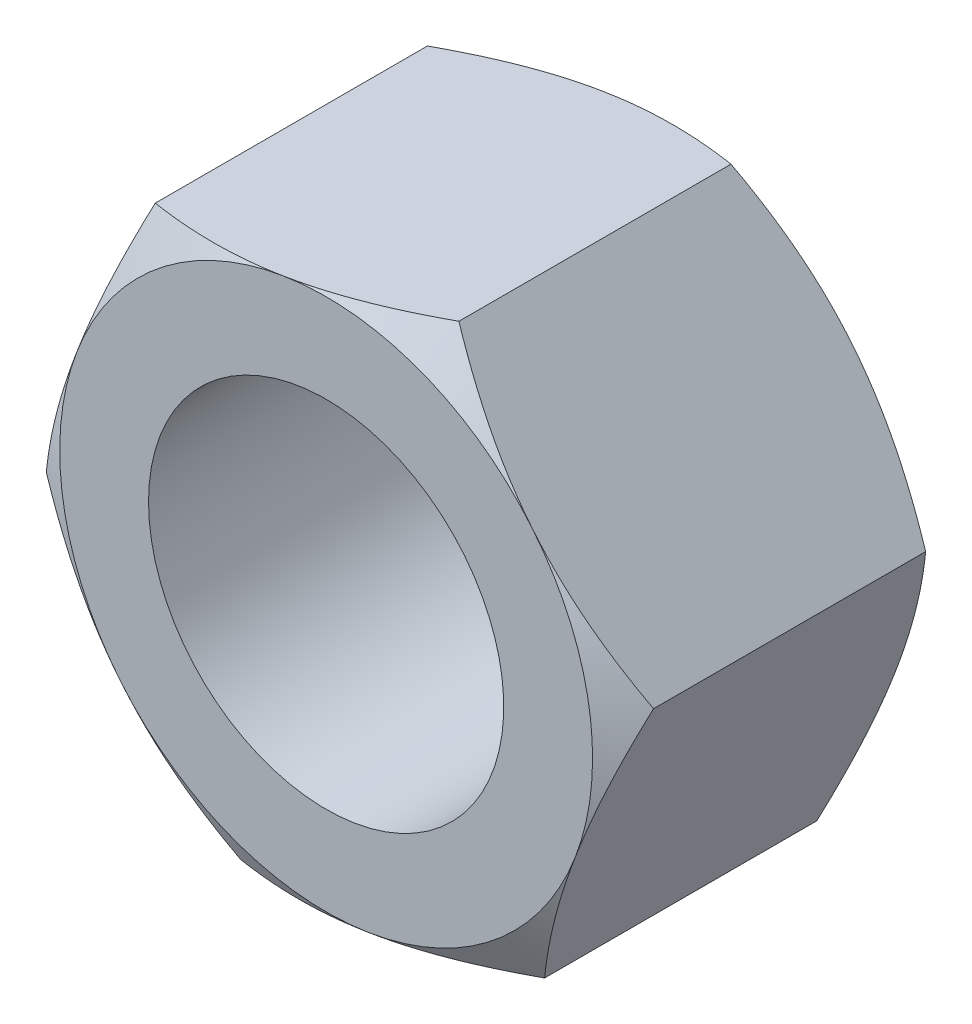
ISO-10303-21;
HEADER;
FILE_DESCRIPTION(('STEP AP214'),'2;1');
FILE_NAME('part.step','',(''),(''),'','','');
FILE_SCHEMA(('AUTOMOTIVE_DESIGN { 1 0 10303 214 1 1 1 1 }'));
ENDSEC;
DATA;
#1=APPLICATION_CONTEXT('core data for automotive mechanical design processes');
#2=APPLICATION_PROTOCOL_DEFINITION('international standard','automotive_design',2000,#1);
#3=PRODUCT_CONTEXT('',#1,'mechanical');
#4=PRODUCT('Part','Part','',(#3));
#5=PRODUCT_RELATED_PRODUCT_CATEGORY('part','',(#4));
#6=PRODUCT_DEFINITION_FORMATION('','',#4);
#7=PRODUCT_DEFINITION_CONTEXT('part definition',#1,'design');
#8=PRODUCT_DEFINITION('design','',#6,#7);
#9=PRODUCT_DEFINITION_SHAPE('','',#8);
#10=(LENGTH_UNIT() NAMED_UNIT(*) SI_UNIT(.MILLI.,.METRE.));
#11=(NAMED_UNIT(*) PLANE_ANGLE_UNIT() SI_UNIT($,.RADIAN.));
#12=(NAMED_UNIT(*) SI_UNIT($,.STERADIAN.) SOLID_ANGLE_UNIT());
#13=UNCERTAINTY_MEASURE_WITH_UNIT(LENGTH_MEASURE(1.E-05),#10,'distance_accuracy_value','');
#14=(GEOMETRIC_REPRESENTATION_CONTEXT(3) GLOBAL_UNCERTAINTY_ASSIGNED_CONTEXT((#13)) GLOBAL_UNIT_ASSIGNED_CONTEXT((#10,
#11,#12)) REPRESENTATION_CONTEXT('',''));
#15=CARTESIAN_POINT('',(0.,0.,0.));
#16=DIRECTION('',(0.,0.,1.));
#17=DIRECTION('',(1.,0.,0.));
#18=AXIS2_PLACEMENT_3D('',#15,#16,#17);
#19=CARTESIAN_POINT('',(17.0948695887191,2.78665278509688,18.));
#20=DIRECTION('',(-0.774299742655268,-0.632819017195269,0.));
#21=DIRECTION('',(0.632819017195269,-0.774299742655268,0.));
#22=AXIS2_PLACEMENT_3D('',#19,#20,#21);
#23=PLANE('',#22);
#24=CARTESIAN_POINT('',(6.13395923511371,16.1981177307612,1.33982052717155));
#25=CARTESIAN_POINT('',(6.37487228960455,15.9033432201573,1.22992936079631));
#26=CARTESIAN_POINT('',(6.61672503455555,15.6074189304512,1.12502482563688));
#27=CARTESIAN_POINT('',(7.10236990078995,15.0131973841175,0.926575134270641));
#28=CARTESIAN_POINT('',(7.34616263199957,14.7148993812012,0.833033714136867));
#29=CARTESIAN_POINT('',(7.8361586338396,14.1153539064011,0.65856763715766));
#30=CARTESIAN_POINT('',(8.08236619230935,13.8141011880365,0.577672832074371));
#31=CARTESIAN_POINT('',(8.57649215903798,13.2095024031058,0.430237032854698));
#32=CARTESIAN_POINT('',(8.82441046886155,12.9061564569825,0.36369521984922));
#33=CARTESIAN_POINT('',(9.31560531086254,12.3051441147166,0.24779566015694));
#34=CARTESIAN_POINT('',(9.55884537602245,12.0075223386019,0.198054307727139));
#35=CARTESIAN_POINT('',(10.046440087133,11.4109150163279,0.11464895428272));
#36=CARTESIAN_POINT('',(10.2907947544456,11.1119294440306,0.0809852627239923));
#37=CARTESIAN_POINT('',(10.779914577764,10.5134560368919,0.0305852201294935));
#38=CARTESIAN_POINT('',(11.0246788981289,10.2139692245173,0.0138287540684656));
#39=CARTESIAN_POINT('',(11.5144334885654,9.614719133994,-0.00239647678352351));
#40=CARTESIAN_POINT('',(11.7594237514215,9.31495586467371,-0.00186577573757736));
#41=CARTESIAN_POINT('',(12.2174323520223,8.75454928405148,0.0152758808352326));
#42=CARTESIAN_POINT('',(12.4304833272438,8.49386603844101,0.0297959665215578));
#43=CARTESIAN_POINT('',(12.8560952122298,7.97309917767838,0.0716361258822598));
#44=CARTESIAN_POINT('',(13.0686560862611,7.71301560624827,0.0989571049486546));
#45=CARTESIAN_POINT('',(13.4931723125134,7.19358936302795,0.165922688252999));
#46=CARTESIAN_POINT('',(13.7051270181676,6.93424748235882,0.205577470877832));
#47=CARTESIAN_POINT('',(14.1280427423889,6.4167795688932,0.296514920580842));
#48=CARTESIAN_POINT('',(14.3390036924066,6.15865361997175,0.34779837815498));
#49=CARTESIAN_POINT('',(14.9793874206901,5.37509790730025,0.520388145329581));
#50=CARTESIAN_POINT('',(15.4069557441958,4.85193720279842,0.658903515519795));
#51=CARTESIAN_POINT('',(16.2557167936781,3.81341679754461,0.973276820642969));
#52=CARTESIAN_POINT('',(16.6769203867982,3.29804380005818,1.14906092301589));
#53=CARTESIAN_POINT('',(17.0950330445443,2.78645278509688,1.33982052717155));
#54=B_SPLINE_CURVE_WITH_KNOTS('',3,(#24,#25,#26,#27,#28,#29,#30,#31,#32,#33,#34,#35,#36,#37,#38,
#39,#40,#41,#42,#43,#44,#45,#46,#47,#48,#49,#50,#51,#52,#53),.UNSPECIFIED.,.F.,.F.,(4,2,2,2,2,2,
2,2,2,2,2,2,2,2,4),(0.,1.18875505102513,2.37789990039879,3.56981061740352,4.76165331533933,
5.9240784402802,7.08652593817755,8.24758880143962,9.4086157885898,10.4193200709789,
11.4300958500779,12.4417079881192,13.4533889143223,15.5212404375788,17.5850330218421),.UNSPECIFIED.);
#55=CARTESIAN_POINT('',(6.13412269093897,16.1979177307612,1.33974596215561));
#56=VERTEX_POINT('',#55);
#57=CARTESIAN_POINT('',(11.614496139829,9.49228525792903,0.));
#58=VERTEX_POINT('',#57);
#59=EDGE_CURVE('E131',#56,#58,#54,.T.);
#60=ORIENTED_EDGE('',*,*,#59,.F.);
#61=DIRECTION('',(0.,0.,-1.));
#62=VECTOR('',#61,1.);
#63=CARTESIAN_POINT('',(6.13412269093897,16.1979177307612,18.));
#64=LINE('',#63,#62);
#65=CARTESIAN_POINT('',(6.13412269093897,16.1979177307612,16.6602540378444));
#66=VERTEX_POINT('',#65);
#67=EDGE_CURVE('E365',#66,#56,#64,.T.);
#68=ORIENTED_EDGE('',*,*,#67,.F.);
#69=CARTESIAN_POINT('',(17.0950330445443,2.78645278509688,16.6601794728284));
#70=CARTESIAN_POINT('',(16.8541199900535,3.08122729570075,16.7700706392037));
#71=CARTESIAN_POINT('',(16.6122672451025,3.37715158540686,16.8749751743631));
#72=CARTESIAN_POINT('',(16.1266223788681,3.97137313174056,17.0734248657294));
#73=CARTESIAN_POINT('',(15.8828296476585,4.26967113465691,17.1669662858631));
#74=CARTESIAN_POINT('',(15.3928336458184,4.86921660945697,17.3414323628423));
#75=CARTESIAN_POINT('',(15.1466260873487,5.1704693278216,17.4223271679256));
#76=CARTESIAN_POINT('',(14.6525001206201,5.77506811275224,17.5697629671453));
#77=CARTESIAN_POINT('',(14.4045818107965,6.07841405887555,17.6363047801508));
#78=CARTESIAN_POINT('',(13.9133869687955,6.67942640114149,17.7522043398431));
#79=CARTESIAN_POINT('',(13.6701469036356,6.97704817725612,17.8019456922729));
#80=CARTESIAN_POINT('',(13.182552192525,7.57365549953015,17.8853510457173));
#81=CARTESIAN_POINT('',(12.9381975252124,7.8726410718275,17.919014737276));
#82=CARTESIAN_POINT('',(12.449077701894,8.47111447896621,17.9694147798705));
#83=CARTESIAN_POINT('',(12.2043133815291,8.77060129134071,17.9861712459315));
#84=CARTESIAN_POINT('',(11.7145587910927,9.36985138186407,18.0023964767835));
#85=CARTESIAN_POINT('',(11.4695685282366,9.66961465118436,18.0018657757376));
#86=CARTESIAN_POINT('',(11.0115599276357,10.2300212318066,17.9847241191648));
#87=CARTESIAN_POINT('',(10.7985089524142,10.4907044774171,17.9702040334784));
#88=CARTESIAN_POINT('',(10.3728970674282,11.0114713381797,17.9283638741177));
#89=CARTESIAN_POINT('',(10.1603361933969,11.2715549096098,17.9010428950513));
#90=CARTESIAN_POINT('',(9.73581996714463,11.7909811528301,17.834077311747));
#91=CARTESIAN_POINT('',(9.52386526149044,12.0503230334992,17.7944225291222));
#92=CARTESIAN_POINT('',(9.10094953726917,12.5677909469649,17.7034850794192));
#93=CARTESIAN_POINT('',(8.8899885872514,12.8259168958863,17.652201621845));
#94=CARTESIAN_POINT('',(8.24960485896793,13.6094726085578,17.4796118546704));
#95=CARTESIAN_POINT('',(7.82203653546219,14.1326333130596,17.3410964844802));
#96=CARTESIAN_POINT('',(6.97327548597991,15.1711537183135,17.026723179357));
#97=CARTESIAN_POINT('',(6.55207189285984,15.6865267157999,16.8509390769841));
#98=CARTESIAN_POINT('',(6.13395923511371,16.1981177307612,16.6601794728284));
#99=B_SPLINE_CURVE_WITH_KNOTS('',3,(#69,#70,#71,#72,#73,#74,#75,#76,#77,#78,#79,#80,#81,#82,#83,
#84,#85,#86,#87,#88,#89,#90,#91,#92,#93,#94,#95,#96,#97,#98),.UNSPECIFIED.,.F.,.F.,(4,2,2,2,2,2,
2,2,2,2,2,2,2,2,4),(0.,1.18875505102512,2.37789990039879,3.56981061740352,4.76165331533933,
5.92407844028021,7.08652593817755,8.24758880143962,9.4086157885898,10.4193200709789,
11.4300958500779,12.4417079881192,13.4533889143223,15.5212404375788,17.5850330218421),.UNSPECIFIED.);
#100=CARTESIAN_POINT('',(11.614496139829,9.49228525792903,18.));
#101=VERTEX_POINT('',#100);
#102=EDGE_CURVE('E325',#101,#66,#99,.T.);
#103=ORIENTED_EDGE('',*,*,#102,.F.);
#104=CARTESIAN_POINT('',(17.0948695887191,2.78665278509688,16.6602540378444));
#105=VERTEX_POINT('',#104);
#106=EDGE_CURVE('E387',#105,#101,#99,.T.);
#107=ORIENTED_EDGE('',*,*,#106,.F.);
#108=DIRECTION('',(0.,0.,-1.));
#109=VECTOR('',#108,1.);
#110=CARTESIAN_POINT('',(17.0948695887191,2.78665278509688,18.));
#111=LINE('',#110,#109);
#112=CARTESIAN_POINT('',(17.0948695887191,2.78665278509688,1.33974596215561));
#113=VERTEX_POINT('',#112);
#114=EDGE_CURVE('E163',#105,#113,#111,.T.);
#115=ORIENTED_EDGE('',*,*,#114,.T.);
#116=EDGE_CURVE('E144',#58,#113,#54,.T.);
#117=ORIENTED_EDGE('',*,*,#116,.F.);
#118=EDGE_LOOP('',(#60,#68,#103,#107,#115,#117));
#119=FACE_BOUND('',#118,.T.);
#120=ADVANCED_FACE('F41',(#119),#23,.F.);
#121=CARTESIAN_POINT('',(6.13412269093897,16.1979177307612,18.));
#122=DIRECTION('',(0.160887473561371,-0.98697275588085,0.));
#123=DIRECTION('',(0.98697275588085,0.160887473561371,0.));
#124=AXIS2_PLACEMENT_3D('',#121,#122,#123);
#125=PLANE('',#124);
#126=CARTESIAN_POINT('',(-10.9609468977801,13.4112323434526,1.33980445975159));
#127=CARTESIAN_POINT('',(-10.5852086186242,13.4724818380243,1.22991395788935));
#128=CARTESIAN_POINT('',(-10.2080047584427,13.5339702385101,1.12501010375016));
#129=CARTESIAN_POINT('',(-9.45057230983405,13.6574401036345,0.926561803908741));
#130=CARTESIAN_POINT('',(-9.07034277014237,13.7194217233397,0.833021094286722));
#131=CARTESIAN_POINT('',(-8.30612413682555,13.8439978116159,0.658556468968256));
#132=CARTESIAN_POINT('',(-7.92212835584389,13.9065933703,0.577662404578657));
#133=CARTESIAN_POINT('',(-7.15146849684379,14.0322194495924,0.430228102794636));
#134=CARTESIAN_POINT('',(-6.76480457234779,14.0952499451748,0.363687046532846));
#135=CARTESIAN_POINT('',(-5.99871619964825,14.2201308216468,0.247788976072664));
#136=CARTESIAN_POINT('',(-5.61934862603502,14.2819719313492,0.19804835842544));
#137=CARTESIAN_POINT('',(-4.85887515754317,14.4059375163434,0.114644467773468));
#138=CARTESIAN_POINT('',(-4.47776922934708,14.4680619970663,0.0809815042327595));
#139=CARTESIAN_POINT('',(-3.71491718118555,14.59241531685,0.0305828918816009));
#140=CARTESIAN_POINT('',(-3.33317236446851,14.6546439434668,0.0138271283382526));
#141=CARTESIAN_POINT('',(-2.56933036070248,14.7791586369614,-0.00239674000065774));
#142=CARTESIAN_POINT('',(-2.18723318490649,14.8414447020047,-0.00186537898052446));
#143=CARTESIAN_POINT('',(-1.47290719130852,14.9578877382733,0.0152773703992494));
#144=CARTESIAN_POINT('',(-1.14062746383091,15.0120530083388,0.0297977558883504));
#145=CARTESIAN_POINT('',(-0.476832332517937,15.1202589552638,0.0716381899207127));
#146=CARTESIAN_POINT('',(-0.145316984411105,15.174299623039,0.0989591438000383));
#147=CARTESIAN_POINT('',(0.516769321829812,15.2822270125804,0.165924364125291));
#148=CARTESIAN_POINT('',(0.847339271606772,15.3361135699732,0.205578808312193));
#149=CARTESIAN_POINT('',(1.50692940830414,15.4436340562753,0.296515291740523));
#150=CARTESIAN_POINT('',(1.83594948831734,15.4972679677575,0.347798121437039));
#151=CARTESIAN_POINT('',(2.83470808273258,15.6600766633327,0.520385540050595));
#152=CARTESIAN_POINT('',(3.50155438310731,15.7687799845559,0.658898760480179));
#153=CARTESIAN_POINT('',(4.82530359998081,15.9845657454724,0.973266949162216));
#154=CARTESIAN_POINT('',(5.48222346436623,16.0916509478587,1.14904808891177));
#155=CARTESIAN_POINT('',(6.13432269093897,16.1979503329729,1.33980445975159));
#156=B_SPLINE_CURVE_WITH_KNOTS('',3,(#126,#127,#128,#129,#130,#131,#132,#133,#134,#135,#136,
#137,#138,#139,#140,#141,#142,#143,#144,#145,#146,#147,#148,#149,#150,#151,#152,#153,#154,#155),
.UNSPECIFIED.,.F.,.F.,(4,2,2,2,2,2,2,2,2,2,2,2,2,2,4),(0.,1.18875314681579,2.37789609110278,
3.56980485096621,4.76164559209222,5.92406899343983,7.08651476830915,8.24757592871961,
9.40860121155788,10.419293173283,11.430056628243,12.4416564000673,13.4533249573674,
15.5211504488646,17.584917185935),.UNSPECIFIED.);
#157=CARTESIAN_POINT('',(-10.9607468977801,13.4112649456643,1.33974596215561));
#158=VERTEX_POINT('',#157);
#159=CARTESIAN_POINT('',(-2.41331210342056,14.8045913382127,0.));
#160=VERTEX_POINT('',#159);
#161=EDGE_CURVE('E58',#158,#160,#156,.T.);
#162=ORIENTED_EDGE('',*,*,#161,.F.);
#163=DIRECTION('',(0.,0.,-1.));
#164=VECTOR('',#163,1.);
#165=CARTESIAN_POINT('',(-10.9607468977801,13.4112649456643,18.));
#166=LINE('',#165,#164);
#167=CARTESIAN_POINT('',(-10.9607468977801,13.4112649456643,16.6602540378444));
#168=VERTEX_POINT('',#167);
#169=EDGE_CURVE('E318',#168,#158,#166,.T.);
#170=ORIENTED_EDGE('',*,*,#169,.F.);
#171=CARTESIAN_POINT('',(6.13432269093897,16.1979503329729,16.6601955402484));
#172=CARTESIAN_POINT('',(5.75858441178304,16.1367008384012,16.7700860421106));
#173=CARTESIAN_POINT('',(5.3813805516016,16.0752124379154,16.8749898962498));
#174=CARTESIAN_POINT('',(4.62394810299293,15.951742572791,17.0734381960913));
#175=CARTESIAN_POINT('',(4.24371856330125,15.8897609530858,17.1669789057133));
#176=CARTESIAN_POINT('',(3.47949992998444,15.7651848648096,17.3414435310317));
#177=CARTESIAN_POINT('',(3.09550414900278,15.7025893061255,17.4223375954213));
#178=CARTESIAN_POINT('',(2.32484429000268,15.5769632268331,17.5697718972054));
#179=CARTESIAN_POINT('',(1.93818036550668,15.5139327312507,17.6363129534672));
#180=CARTESIAN_POINT('',(1.17209199280714,15.3890518547787,17.7522110239273));
#181=CARTESIAN_POINT('',(0.792724419193907,15.3272107450763,17.8019516415746));
#182=CARTESIAN_POINT('',(0.0322509507020562,15.2032451600821,17.8853555322265));
#183=CARTESIAN_POINT('',(-0.348854977494027,15.1411206793592,17.9190184957672));
#184=CARTESIAN_POINT('',(-1.11170702565556,15.0167673595755,17.9694171081184));
#185=CARTESIAN_POINT('',(-1.49345184237261,14.9545387329586,17.9861728716617));
#186=CARTESIAN_POINT('',(-2.25729384613863,14.8300240394641,18.0023967400007));
#187=CARTESIAN_POINT('',(-2.63939102193462,14.7677379744208,18.0018653789805));
#188=CARTESIAN_POINT('',(-3.35371701553259,14.6512949381522,17.9847226296007));
#189=CARTESIAN_POINT('',(-3.6859967430102,14.5971296680867,17.9702022441116));
#190=CARTESIAN_POINT('',(-4.34979187432318,14.4889237211617,17.9283618100793));
#191=CARTESIAN_POINT('',(-4.68130722243001,14.4348830533865,17.9010408562));
#192=CARTESIAN_POINT('',(-5.34339352867093,14.3269556638451,17.8340756358747));
#193=CARTESIAN_POINT('',(-5.67396347844789,14.2730691064523,17.7944211916878));
#194=CARTESIAN_POINT('',(-6.33355361514526,14.1655486201502,17.7034847082595));
#195=CARTESIAN_POINT('',(-6.66257369515846,14.111914708668,17.652201878563));
#196=CARTESIAN_POINT('',(-7.66133228957369,13.9491060130928,17.4796144599494));
#197=CARTESIAN_POINT('',(-8.32817858994842,13.8404026918696,17.3411012395198));
#198=CARTESIAN_POINT('',(-9.65192780682192,13.6246169309531,17.0267330508378));
#199=CARTESIAN_POINT('',(-10.3088476712073,13.5175317285668,16.8509519110882));
#200=CARTESIAN_POINT('',(-10.9609468977801,13.4112323434526,16.6601955402484));
#201=B_SPLINE_CURVE_WITH_KNOTS('',3,(#171,#172,#173,#174,#175,#176,#177,#178,#179,#180,#181,
#182,#183,#184,#185,#186,#187,#188,#189,#190,#191,#192,#193,#194,#195,#196,#197,#198,#199,#200),
.UNSPECIFIED.,.F.,.F.,(4,2,2,2,2,2,2,2,2,2,2,2,2,2,4),(0.,1.18875314681579,2.37789609110279,
3.56980485096621,4.76164559209222,5.92406899343983,7.08651476830915,8.24757592871961,
9.40860121155788,10.419293173283,11.430056628243,12.4416564000673,13.4533249573674,
15.5211504488646,17.584917185935),.UNSPECIFIED.);
#202=CARTESIAN_POINT('',(-2.41331210342056,14.8045913382127,18.));
#203=VERTEX_POINT('',#202);
#204=EDGE_CURVE('E276',#203,#168,#201,.T.);
#205=ORIENTED_EDGE('',*,*,#204,.F.);
#206=EDGE_CURVE('E316',#66,#203,#201,.T.);
#207=ORIENTED_EDGE('',*,*,#206,.F.);
#208=ORIENTED_EDGE('',*,*,#67,.T.);
#209=EDGE_CURVE('E137',#160,#56,#156,.T.);
#210=ORIENTED_EDGE('',*,*,#209,.F.);
#211=EDGE_LOOP('',(#162,#170,#205,#207,#208,#210));
#212=FACE_BOUND('',#211,.T.);
#213=ADVANCED_FACE('F269',(#212),#125,.F.);
#214=CARTESIAN_POINT('',(-10.9607468977801,13.4112649456643,18.));
#215=DIRECTION('',(0.935187216216638,-0.35415373868558,0.));
#216=DIRECTION('',(0.35415373868558,0.935187216216639,0.));
#217=AXIS2_PLACEMENT_3D('',#214,#215,#216);
#218=PLANE('',#217);
#219=CARTESIAN_POINT('',(-17.094945328364,-2.78685278509689,1.33980769905766));
#220=CARTESIAN_POINT('',(-16.9601197735841,-2.43082905450622,1.22991706322458));
#221=CARTESIAN_POINT('',(-16.8247683267292,-2.07341664015488,1.12501307178656));
#222=CARTESIAN_POINT('',(-16.552980074287,-1.35572578604979,0.926564491403214));
#223=CARTESIAN_POINT('',(-16.416542927359,-0.99544644494285,0.833023638536655));
#224=CARTESIAN_POINT('',(-16.1423195969923,-0.271325463193252,0.658558720552432));
#225=CARTESIAN_POINT('',(-16.0045310139302,0.0925225139550165,0.577664506833408));
#226=CARTESIAN_POINT('',(-15.7279963858749,0.822746766163537,0.430229903155104));
#227=CARTESIAN_POINT('',(-15.58925039597,1.18912289575622,0.363688694328109));
#228=CARTESIAN_POINT('',(-15.3143561484101,1.91501551821913,0.247790323627574));
#229=CARTESIAN_POINT('',(-15.1782282990387,2.27447812046544,0.19804955784268));
#230=CARTESIAN_POINT('',(-14.9053488393907,2.99505044359836,0.114645372280833));
#231=CARTESIAN_POINT('',(-14.7685972171589,3.35616019605423,0.080982261966275));
#232=CARTESIAN_POINT('',(-14.4948642519955,4.07898630718887,0.0305833612674542));
#233=CARTESIAN_POINT('',(-14.3578833767102,4.4407014309891,0.0138274560913512));
#234=CARTESIAN_POINT('',(-14.083795183463,5.16446556628271,-0.0023966869402264));
#235=CARTESIAN_POINT('',(-13.9466878695389,5.52651456711345,-0.00186545897572922));
#236=CARTESIAN_POINT('',(-13.6903671644308,6.20336142903963,0.0152770700871651));
#237=CARTESIAN_POINT('',(-13.571135505908,6.51820752732628,0.0297973951347159));
#238=CARTESIAN_POINT('',(-13.332946450113,7.147175502785,0.0716377737927648));
#239=CARTESIAN_POINT('',(-13.2139890728379,7.46129732715212,0.0989587327506077));
#240=CARTESIAN_POINT('',(-12.9764131927591,8.08864613548519,0.165924026256079));
#241=CARTESIAN_POINT('',(-12.8577950517866,8.40187216399066,0.205578538674899));
#242=CARTESIAN_POINT('',(-12.6211148711776,9.02685576591131,0.296515216911753));
#243=CARTESIAN_POINT('',(-12.5030528699028,9.33861323802757,0.347798173193113));
#244=CARTESIAN_POINT('',(-12.144669140369,10.2849702738278,0.520386065293765));
#245=CARTESIAN_POINT('',(-11.9053852258215,10.9168293606798,0.658899719130353));
#246=CARTESIAN_POINT('',(-11.4303853845061,12.1711258166533,0.973268939323096));
#247=CARTESIAN_POINT('',(-11.1946633762852,12.7935792446118,1.14905067635842));
#248=CARTESIAN_POINT('',(-10.9606711581351,13.4114649456643,1.33980769905766));
#249=B_SPLINE_CURVE_WITH_KNOTS('',3,(#219,#220,#221,#222,#223,#224,#225,#226,#227,#228,#229,
#230,#231,#232,#233,#234,#235,#236,#237,#238,#239,#240,#241,#242,#243,#244,#245,#246,#247,#248),
.UNSPECIFIED.,.F.,.F.,(4,2,2,2,2,2,2,2,2,2,2,2,2,2,4),(0.,1.18875353071797,2.37789685908402,
3.56980601352109,4.76164714915392,5.92407089799017,7.08651702023417,8.24757852395162,
9.40860415039128,10.4192985960554,11.4300645356548,12.4416668006018,13.453337851566,
15.5211685912606,17.5849405393188),.UNSPECIFIED.);
#250=CARTESIAN_POINT('',(-17.0948695887191,-2.78665278509689,1.33974596215561));
#251=VERTEX_POINT('',#250);
#252=CARTESIAN_POINT('',(-14.0278082432496,5.3123060802837,0.));
#253=VERTEX_POINT('',#252);
#254=EDGE_CURVE('E65',#251,#253,#249,.T.);
#255=ORIENTED_EDGE('',*,*,#254,.F.);
#256=DIRECTION('',(0.,0.,-1.));
#257=VECTOR('',#256,1.);
#258=CARTESIAN_POINT('',(-17.0948695887191,-2.78665278509689,18.));
#259=LINE('',#258,#257);
#260=CARTESIAN_POINT('',(-17.0948695887191,-2.78665278509689,16.6602540378444));
#261=VERTEX_POINT('',#260);
#262=EDGE_CURVE('E353',#261,#251,#259,.T.);
#263=ORIENTED_EDGE('',*,*,#262,.F.);
#264=CARTESIAN_POINT('',(-10.9606711581351,13.4114649456643,16.6601923009423));
#265=CARTESIAN_POINT('',(-11.095496712915,13.0554412150736,16.7700829367754));
#266=CARTESIAN_POINT('',(-11.23084815977,12.6980288007223,16.8749869282134));
#267=CARTESIAN_POINT('',(-11.5026364122121,11.9803379466172,17.0734355085968));
#268=CARTESIAN_POINT('',(-11.6390735591402,11.6200586055103,17.1669763614633));
#269=CARTESIAN_POINT('',(-11.9132968895069,10.8959376237607,17.3414412794476));
#270=CARTESIAN_POINT('',(-12.0510854725689,10.5320896466124,17.4223354931666));
#271=CARTESIAN_POINT('',(-12.3276201006242,9.80186539440387,17.5697700968449));
#272=CARTESIAN_POINT('',(-12.4663660905291,9.43548926481119,17.6363113056719));
#273=CARTESIAN_POINT('',(-12.7412603380891,8.70959664234828,17.7522096763724));
#274=CARTESIAN_POINT('',(-12.8773881874604,8.35013404010198,17.8019504421573));
#275=CARTESIAN_POINT('',(-13.1502676471084,7.62956171696906,17.8853546277192));
#276=CARTESIAN_POINT('',(-13.2870192693402,7.26845196451318,17.9190177380337));
#277=CARTESIAN_POINT('',(-13.5607522345036,6.54562585337854,17.9694166387325));
#278=CARTESIAN_POINT('',(-13.6977331097889,6.18391072957832,17.9861725439086));
#279=CARTESIAN_POINT('',(-13.9718213030362,5.46014659428471,18.0023966869402));
#280=CARTESIAN_POINT('',(-14.1089286169602,5.09809759345397,18.0018654589757));
#281=CARTESIAN_POINT('',(-14.3652493220684,4.42125073152779,17.9847229299128));
#282=CARTESIAN_POINT('',(-14.4844809805911,4.10640463324114,17.9702026048653));
#283=CARTESIAN_POINT('',(-14.7226700363861,3.47743665778241,17.9283622262072));
#284=CARTESIAN_POINT('',(-14.8416274136613,3.1633148334153,17.9010412672494));
#285=CARTESIAN_POINT('',(-15.07920329374,2.53596602508222,17.8340759737439));
#286=CARTESIAN_POINT('',(-15.1978214347125,2.22273999657675,17.7944214613251));
#287=CARTESIAN_POINT('',(-15.4345016153215,1.5977563946561,17.7034847830882));
#288=CARTESIAN_POINT('',(-15.5525636165963,1.28599892253984,17.6522018268069));
#289=CARTESIAN_POINT('',(-15.9109473461301,0.339641886739611,17.4796139347062));
#290=CARTESIAN_POINT('',(-16.1502312606776,-0.292217200112371,17.3411002808696));
#291=CARTESIAN_POINT('',(-16.625231101993,-1.54651365608591,17.0267310606769));
#292=CARTESIAN_POINT('',(-16.860953110214,-2.16896708404437,16.8509493236416));
#293=CARTESIAN_POINT('',(-17.094945328364,-2.78685278509689,16.6601923009423));
#294=B_SPLINE_CURVE_WITH_KNOTS('',3,(#264,#265,#266,#267,#268,#269,#270,#271,#272,#273,#274,
#275,#276,#277,#278,#279,#280,#281,#282,#283,#284,#285,#286,#287,#288,#289,#290,#291,#292,#293),
.UNSPECIFIED.,.F.,.F.,(4,2,2,2,2,2,2,2,2,2,2,2,2,2,4),(0.,1.18875353071797,2.37789685908403,
3.56980601352109,4.76164714915392,5.92407089799017,7.08651702023417,8.24757852395162,
9.40860415039128,10.4192985960554,11.4300645356548,12.4416668006018,13.453337851566,
15.5211685912606,17.5849405393188),.UNSPECIFIED.);
#295=CARTESIAN_POINT('',(-14.0278082432496,5.3123060802837,18.));
#296=VERTEX_POINT('',#295);
#297=EDGE_CURVE('E255',#296,#261,#294,.T.);
#298=ORIENTED_EDGE('',*,*,#297,.F.);
#299=EDGE_CURVE('E322',#168,#296,#294,.T.);
#300=ORIENTED_EDGE('',*,*,#299,.F.);
#301=ORIENTED_EDGE('',*,*,#169,.T.);
#302=EDGE_CURVE('E202',#253,#158,#249,.T.);
#303=ORIENTED_EDGE('',*,*,#302,.F.);
#304=EDGE_LOOP('',(#255,#263,#298,#300,#301,#303));
#305=FACE_BOUND('',#304,.T.);
#306=ADVANCED_FACE('F264',(#305),#218,.F.);
#307=CARTESIAN_POINT('',(-17.0948695887191,-2.78665278509689,18.));
#308=DIRECTION('',(0.774299742655267,0.632819017195269,0.));
#309=DIRECTION('',(-0.632819017195269,0.774299742655268,0.));
#310=AXIS2_PLACEMENT_3D('',#307,#308,#309);
#311=PLANE('',#310);
#312=CARTESIAN_POINT('',(-6.1339592351137,-16.1981177307612,1.33982052717155));
#313=CARTESIAN_POINT('',(-6.37487228960454,-15.9033432201573,1.2299293607963));
#314=CARTESIAN_POINT('',(-6.61672503455554,-15.6074189304512,1.12502482563688));
#315=CARTESIAN_POINT('',(-7.10236990078994,-15.0131973841175,0.926575134270642));
#316=CARTESIAN_POINT('',(-7.34616263199956,-14.7148993812012,0.83303371413687));
#317=CARTESIAN_POINT('',(-7.83615863383959,-14.1153539064011,0.658567637157663));
#318=CARTESIAN_POINT('',(-8.08236619230934,-13.8141011880365,0.577672832074372));
#319=CARTESIAN_POINT('',(-8.57649215903797,-13.2095024031058,0.430237032854698));
#320=CARTESIAN_POINT('',(-8.82441046886154,-12.9061564569825,0.36369521984922));
#321=CARTESIAN_POINT('',(-9.31560531086253,-12.3051441147166,0.24779566015694));
#322=CARTESIAN_POINT('',(-9.55884537602244,-12.0075223386019,0.198054307727139));
#323=CARTESIAN_POINT('',(-10.046440087133,-11.4109150163279,0.114648954282719));
#324=CARTESIAN_POINT('',(-10.2907947544456,-11.1119294440306,0.0809852627239907));
#325=CARTESIAN_POINT('',(-10.779914577764,-10.5134560368919,0.030585220129492));
#326=CARTESIAN_POINT('',(-11.0246788981289,-10.2139692245174,0.0138287540684648));
#327=CARTESIAN_POINT('',(-11.5144334885654,-9.614719133994,-0.00239647678352376));
#328=CARTESIAN_POINT('',(-11.7594237514214,-9.31495586467372,-0.00186577573757785));
#329=CARTESIAN_POINT('',(-12.2174323520223,-8.75454928405149,0.0152758808352312));
#330=CARTESIAN_POINT('',(-12.4304833272438,-8.49386603844101,0.0297959665215557));
#331=CARTESIAN_POINT('',(-12.8560952122298,-7.97309917767839,0.0716361258822575));
#332=CARTESIAN_POINT('',(-13.0686560862611,-7.71301560624828,0.0989571049486527));
#333=CARTESIAN_POINT('',(-13.4931723125134,-7.19358936302796,0.165922688252998));
#334=CARTESIAN_POINT('',(-13.7051270181676,-6.93424748235883,0.205577470877831));
#335=CARTESIAN_POINT('',(-14.1280427423889,-6.41677956889321,0.29651492058084));
#336=CARTESIAN_POINT('',(-14.3390036924066,-6.15865361997176,0.347798378154978));
#337=CARTESIAN_POINT('',(-14.9793874206901,-5.37509790730026,0.520388145329579));
#338=CARTESIAN_POINT('',(-15.4069557441958,-4.85193720279843,0.658903515519794));
#339=CARTESIAN_POINT('',(-16.2557167936781,-3.81341679754462,0.973276820642968));
#340=CARTESIAN_POINT('',(-16.6769203867982,-3.29804380005819,1.14906092301589));
#341=CARTESIAN_POINT('',(-17.0950330445443,-2.78645278509689,1.33982052717155));
#342=B_SPLINE_CURVE_WITH_KNOTS('',3,(#312,#313,#314,#315,#316,#317,#318,#319,#320,#321,#322,
#323,#324,#325,#326,#327,#328,#329,#330,#331,#332,#333,#334,#335,#336,#337,#338,#339,#340,#341),
.UNSPECIFIED.,.F.,.F.,(4,2,2,2,2,2,2,2,2,2,2,2,2,2,4),(0.,1.18875505102512,2.37789990039878,
3.56981061740351,4.76165331533933,5.9240784402802,7.08652593817754,8.24758880143962,
9.40861578858979,10.4193200709789,11.4300958500778,12.4417079881192,13.4533889143223,
15.5212404375788,17.5850330218421),.UNSPECIFIED.);
#343=CARTESIAN_POINT('',(-6.13412269093896,-16.1979177307612,1.33974596215561));
#344=VERTEX_POINT('',#343);
#345=CARTESIAN_POINT('',(-11.614496139829,-9.49228525792904,0.));
#346=VERTEX_POINT('',#345);
#347=EDGE_CURVE('E180',#344,#346,#342,.T.);
#348=ORIENTED_EDGE('',*,*,#347,.F.);
#349=DIRECTION('',(0.,0.,-1.));
#350=VECTOR('',#349,1.);
#351=CARTESIAN_POINT('',(-6.13412269093896,-16.1979177307612,18.));
#352=LINE('',#351,#350);
#353=CARTESIAN_POINT('',(-6.13412269093896,-16.1979177307612,16.6602540378444));
#354=VERTEX_POINT('',#353);
#355=EDGE_CURVE('E349',#354,#344,#352,.T.);
#356=ORIENTED_EDGE('',*,*,#355,.F.);
#357=CARTESIAN_POINT('',(-17.0950330445443,-2.78645278509689,16.6601794728284));
#358=CARTESIAN_POINT('',(-16.8541199900535,-3.08122729570076,16.7700706392037));
#359=CARTESIAN_POINT('',(-16.6122672451025,-3.37715158540687,16.8749751743631));
#360=CARTESIAN_POINT('',(-16.1266223788681,-3.97137313174057,17.0734248657294));
#361=CARTESIAN_POINT('',(-15.8828296476585,-4.26967113465691,17.1669662858631));
#362=CARTESIAN_POINT('',(-15.3928336458184,-4.86921660945698,17.3414323628423));
#363=CARTESIAN_POINT('',(-15.1466260873487,-5.1704693278216,17.4223271679256));
#364=CARTESIAN_POINT('',(-14.65250012062,-5.77506811275225,17.5697629671453));
#365=CARTESIAN_POINT('',(-14.4045818107965,-6.07841405887555,17.6363047801508));
#366=CARTESIAN_POINT('',(-13.9133869687955,-6.67942640114149,17.7522043398431));
#367=CARTESIAN_POINT('',(-13.6701469036356,-6.97704817725613,17.8019456922729));
#368=CARTESIAN_POINT('',(-13.182552192525,-7.57365549953016,17.8853510457173));
#369=CARTESIAN_POINT('',(-12.9381975252124,-7.8726410718275,17.919014737276));
#370=CARTESIAN_POINT('',(-12.449077701894,-8.47111447896621,17.9694147798705));
#371=CARTESIAN_POINT('',(-12.2043133815291,-8.77060129134072,17.9861712459315));
#372=CARTESIAN_POINT('',(-11.7145587910926,-9.36985138186407,18.0023964767835));
#373=CARTESIAN_POINT('',(-11.4695685282366,-9.66961465118436,18.0018657757376));
#374=CARTESIAN_POINT('',(-11.0115599276357,-10.2300212318066,17.9847241191648));
#375=CARTESIAN_POINT('',(-10.7985089524142,-10.4907044774171,17.9702040334784));
#376=CARTESIAN_POINT('',(-10.3728970674282,-11.0114713381797,17.9283638741177));
#377=CARTESIAN_POINT('',(-10.1603361933969,-11.2715549096098,17.9010428950513));
#378=CARTESIAN_POINT('',(-9.73581996714463,-11.7909811528301,17.834077311747));
#379=CARTESIAN_POINT('',(-9.52386526149044,-12.0503230334992,17.7944225291222));
#380=CARTESIAN_POINT('',(-9.10094953726916,-12.5677909469649,17.7034850794192));
#381=CARTESIAN_POINT('',(-8.88998858725139,-12.8259168958863,17.652201621845));
#382=CARTESIAN_POINT('',(-8.24960485896792,-13.6094726085578,17.4796118546704));
#383=CARTESIAN_POINT('',(-7.82203653546219,-14.1326333130596,17.3410964844802));
#384=CARTESIAN_POINT('',(-6.9732754859799,-15.1711537183135,17.026723179357));
#385=CARTESIAN_POINT('',(-6.55207189285983,-15.6865267157999,16.8509390769841));
#386=CARTESIAN_POINT('',(-6.1339592351137,-16.1981177307612,16.6601794728284));
#387=B_SPLINE_CURVE_WITH_KNOTS('',3,(#357,#358,#359,#360,#361,#362,#363,#364,#365,#366,#367,
#368,#369,#370,#371,#372,#373,#374,#375,#376,#377,#378,#379,#380,#381,#382,#383,#384,#385,#386),
.UNSPECIFIED.,.F.,.F.,(4,2,2,2,2,2,2,2,2,2,2,2,2,2,4),(0.,1.18875505102512,2.37789990039879,
3.56981061740352,4.76165331533933,5.9240784402802,7.08652593817754,8.24758880143962,
9.40861578858979,10.4193200709789,11.4300958500778,12.4417079881192,13.4533889143223,
15.5212404375788,17.5850330218421),.UNSPECIFIED.);
#388=CARTESIAN_POINT('',(-11.614496139829,-9.49228525792904,18.));
#389=VERTEX_POINT('',#388);
#390=EDGE_CURVE('E247',#389,#354,#387,.T.);
#391=ORIENTED_EDGE('',*,*,#390,.F.);
#392=EDGE_CURVE('E254',#261,#389,#387,.T.);
#393=ORIENTED_EDGE('',*,*,#392,.F.);
#394=ORIENTED_EDGE('',*,*,#262,.T.);
#395=EDGE_CURVE('E289',#346,#251,#342,.T.);
#396=ORIENTED_EDGE('',*,*,#395,.F.);
#397=EDGE_LOOP('',(#348,#356,#391,#393,#394,#396));
#398=FACE_BOUND('',#397,.T.);
#399=ADVANCED_FACE('F261',(#398),#311,.F.);
#400=CARTESIAN_POINT('',(-6.13412269093896,-16.1979177307612,18.));
#401=DIRECTION('',(-0.16088747356137,0.98697275588085,0.));
#402=DIRECTION('',(-0.98697275588085,-0.160887473561371,0.));
#403=AXIS2_PLACEMENT_3D('',#400,#401,#402);
#404=PLANE('',#403);
#405=CARTESIAN_POINT('',(10.9609468977801,-13.4112323434526,1.33980445975159));
#406=CARTESIAN_POINT('',(10.5852086186242,-13.4724818380243,1.22991395788935));
#407=CARTESIAN_POINT('',(10.2080047584427,-13.5339702385101,1.12501010375016));
#408=CARTESIAN_POINT('',(9.45057230983405,-13.6574401036345,0.926561803908745));
#409=CARTESIAN_POINT('',(9.07034277014237,-13.7194217233397,0.833021094286725));
#410=CARTESIAN_POINT('',(8.30612413682556,-13.8439978116159,0.658556468968259));
#411=CARTESIAN_POINT('',(7.92212835584389,-13.9065933703,0.577662404578661));
#412=CARTESIAN_POINT('',(7.1514684968438,-14.0322194495924,0.43022810279464));
#413=CARTESIAN_POINT('',(6.76480457234779,-14.0952499451748,0.36368704653285));
#414=CARTESIAN_POINT('',(5.99871619964825,-14.2201308216468,0.247788976072668));
#415=CARTESIAN_POINT('',(5.61934862603502,-14.2819719313492,0.198048358425442));
#416=CARTESIAN_POINT('',(4.85887515754317,-14.4059375163434,0.114644467773471));
#417=CARTESIAN_POINT('',(4.47776922934708,-14.4680619970663,0.0809815042327615));
#418=CARTESIAN_POINT('',(3.71491718118555,-14.59241531685,0.0305828918816034));
#419=CARTESIAN_POINT('',(3.33317236446851,-14.6546439434669,0.0138271283382556));
#420=CARTESIAN_POINT('',(2.56933036070248,-14.7791586369614,-0.00239674000065427));
#421=CARTESIAN_POINT('',(2.18723318490649,-14.8414447020047,-0.00186537898052109));
#422=CARTESIAN_POINT('',(1.47290719130852,-14.9578877382733,0.0152773703992527));
#423=CARTESIAN_POINT('',(1.14062746383091,-15.0120530083388,0.0297977558883538));
#424=CARTESIAN_POINT('',(0.476832332517935,-15.1202589552638,0.071638189920716));
#425=CARTESIAN_POINT('',(0.145316984411104,-15.174299623039,0.0989591438000415));
#426=CARTESIAN_POINT('',(-0.516769321829812,-15.2822270125804,0.165924364125294));
#427=CARTESIAN_POINT('',(-0.847339271606772,-15.3361135699732,0.205578808312196));
#428=CARTESIAN_POINT('',(-1.50692940830414,-15.4436340562753,0.296515291740526));
#429=CARTESIAN_POINT('',(-1.83594948831734,-15.4972679677575,0.347798121437041));
#430=CARTESIAN_POINT('',(-2.83470808273257,-15.6600766633327,0.520385540050596));
#431=CARTESIAN_POINT('',(-3.5015543831073,-15.7687799845559,0.65889876048018));
#432=CARTESIAN_POINT('',(-4.8253035999808,-15.9845657454724,0.973266949162216));
#433=CARTESIAN_POINT('',(-5.48222346436622,-16.0916509478587,1.14904808891177));
#434=CARTESIAN_POINT('',(-6.13432269093896,-16.1979503329729,1.33980445975159));
#435=B_SPLINE_CURVE_WITH_KNOTS('',3,(#405,#406,#407,#408,#409,#410,#411,#412,#413,#414,#415,
#416,#417,#418,#419,#420,#421,#422,#423,#424,#425,#426,#427,#428,#429,#430,#431,#432,#433,#434),
.UNSPECIFIED.,.F.,.F.,(4,2,2,2,2,2,2,2,2,2,2,2,2,2,4),(0.,1.18875314681579,2.37789609110278,
3.56980485096621,4.76164559209222,5.92406899343983,7.08651476830915,8.24757592871961,
9.40860121155788,10.419293173283,11.430056628243,12.4416564000673,13.4533249573673,
15.5211504488646,17.584917185935),.UNSPECIFIED.);
#436=CARTESIAN_POINT('',(10.9607468977801,-13.4112649456643,1.33974596215561));
#437=VERTEX_POINT('',#436);
#438=CARTESIAN_POINT('',(2.41331210342056,-14.8045913382127,0.));
#439=VERTEX_POINT('',#438);
#440=EDGE_CURVE('E165',#437,#439,#435,.T.);
#441=ORIENTED_EDGE('',*,*,#440,.F.);
#442=DIRECTION('',(0.,0.,-1.));
#443=VECTOR('',#442,1.);
#444=CARTESIAN_POINT('',(10.9607468977801,-13.4112649456643,18.));
#445=LINE('',#444,#443);
#446=CARTESIAN_POINT('',(10.9607468977801,-13.4112649456643,16.6602540378444));
#447=VERTEX_POINT('',#446);
#448=EDGE_CURVE('E354',#447,#437,#445,.T.);
#449=ORIENTED_EDGE('',*,*,#448,.F.);
#450=CARTESIAN_POINT('',(-6.13432269093896,-16.1979503329729,16.6601955402484));
#451=CARTESIAN_POINT('',(-5.75858441178303,-16.1367008384012,16.7700860421107));
#452=CARTESIAN_POINT('',(-5.38138055160159,-16.0752124379154,16.8749898962498));
#453=CARTESIAN_POINT('',(-4.62394810299292,-15.951742572791,17.0734381960913));
#454=CARTESIAN_POINT('',(-4.24371856330124,-15.8897609530858,17.1669789057133));
#455=CARTESIAN_POINT('',(-3.47949992998443,-15.7651848648096,17.3414435310317));
#456=CARTESIAN_POINT('',(-3.09550414900277,-15.7025893061255,17.4223375954213));
#457=CARTESIAN_POINT('',(-2.32484429000267,-15.5769632268331,17.5697718972054));
#458=CARTESIAN_POINT('',(-1.93818036550667,-15.5139327312507,17.6363129534672));
#459=CARTESIAN_POINT('',(-1.17209199280713,-15.3890518547787,17.7522110239273));
#460=CARTESIAN_POINT('',(-0.792724419193895,-15.3272107450763,17.8019516415746));
#461=CARTESIAN_POINT('',(-0.032250950702044,-15.2032451600821,17.8853555322265));
#462=CARTESIAN_POINT('',(0.34885497749404,-15.1411206793592,17.9190184957672));
#463=CARTESIAN_POINT('',(1.11170702565557,-15.0167673595755,17.9694171081184));
#464=CARTESIAN_POINT('',(1.49345184237262,-14.9545387329586,17.9861728716617));
#465=CARTESIAN_POINT('',(2.25729384613864,-14.8300240394641,18.0023967400007));
#466=CARTESIAN_POINT('',(2.63939102193463,-14.7677379744208,18.0018653789805));
#467=CARTESIAN_POINT('',(3.3537170155326,-14.6512949381522,17.9847226296007));
#468=CARTESIAN_POINT('',(3.68599674301021,-14.5971296680867,17.9702022441116));
#469=CARTESIAN_POINT('',(4.34979187432319,-14.4889237211617,17.9283618100793));
#470=CARTESIAN_POINT('',(4.68130722243002,-14.4348830533865,17.9010408562));
#471=CARTESIAN_POINT('',(5.34339352867093,-14.3269556638451,17.8340756358747));
#472=CARTESIAN_POINT('',(5.67396347844789,-14.2730691064523,17.7944211916878));
#473=CARTESIAN_POINT('',(6.33355361514526,-14.1655486201502,17.7034847082595));
#474=CARTESIAN_POINT('',(6.66257369515846,-14.111914708668,17.652201878563));
#475=CARTESIAN_POINT('',(7.6613322895737,-13.9491060130928,17.4796144599494));
#476=CARTESIAN_POINT('',(8.32817858994843,-13.8404026918696,17.3411012395198));
#477=CARTESIAN_POINT('',(9.65192780682193,-13.6246169309531,17.0267330508378));
#478=CARTESIAN_POINT('',(10.3088476712073,-13.5175317285668,16.8509519110882));
#479=CARTESIAN_POINT('',(10.9609468977801,-13.4112323434526,16.6601955402484));
#480=B_SPLINE_CURVE_WITH_KNOTS('',3,(#450,#451,#452,#453,#454,#455,#456,#457,#458,#459,#460,
#461,#462,#463,#464,#465,#466,#467,#468,#469,#470,#471,#472,#473,#474,#475,#476,#477,#478,#479),
.UNSPECIFIED.,.F.,.F.,(4,2,2,2,2,2,2,2,2,2,2,2,2,2,4),(0.,1.18875314681579,2.37789609110278,
3.56980485096621,4.76164559209222,5.92406899343983,7.08651476830915,8.24757592871961,
9.40860121155788,10.419293173283,11.430056628243,12.4416564000673,13.4533249573673,
15.5211504488646,17.584917185935),.UNSPECIFIED.);
#481=CARTESIAN_POINT('',(2.41331210342056,-14.8045913382127,18.));
#482=VERTEX_POINT('',#481);
#483=EDGE_CURVE('E239',#482,#447,#480,.T.);
#484=ORIENTED_EDGE('',*,*,#483,.F.);
#485=EDGE_CURVE('E246',#354,#482,#480,.T.);
#486=ORIENTED_EDGE('',*,*,#485,.F.);
#487=ORIENTED_EDGE('',*,*,#355,.T.);
#488=EDGE_CURVE('E143',#439,#344,#435,.T.);
#489=ORIENTED_EDGE('',*,*,#488,.F.);
#490=EDGE_LOOP('',(#441,#449,#484,#486,#487,#489));
#491=FACE_BOUND('',#490,.T.);
#492=ADVANCED_FACE('F225',(#491),#404,.F.);
#493=CARTESIAN_POINT('',(10.9607468977801,-13.4112649456643,18.));
#494=DIRECTION('',(-0.935187216216638,0.354153738685581,0.));
#495=DIRECTION('',(-0.354153738685581,-0.935187216216639,0.));
#496=AXIS2_PLACEMENT_3D('',#493,#494,#495);
#497=PLANE('',#496);
#498=CARTESIAN_POINT('',(17.094945328364,2.78685278509688,1.33980769905766));
#499=CARTESIAN_POINT('',(16.9601197735841,2.43082905450621,1.22991706322457));
#500=CARTESIAN_POINT('',(16.8247683267292,2.07341664015488,1.12501307178656));
#501=CARTESIAN_POINT('',(16.552980074287,1.35572578604979,0.926564491403217));
#502=CARTESIAN_POINT('',(16.416542927359,0.995446444942844,0.833023638536659));
#503=CARTESIAN_POINT('',(16.1423195969923,0.271325463193246,0.658558720552437));
#504=CARTESIAN_POINT('',(16.0045310139302,-0.0925225139550215,0.577664506833411));
#505=CARTESIAN_POINT('',(15.7279963858749,-0.822746766163541,0.430229903155105));
#506=CARTESIAN_POINT('',(15.58925039597,-1.18912289575623,0.36368869432811));
#507=CARTESIAN_POINT('',(15.3143561484101,-1.91501551821914,0.247790323627576));
#508=CARTESIAN_POINT('',(15.1782282990387,-2.27447812046544,0.198049557842682));
#509=CARTESIAN_POINT('',(14.9053488393907,-2.99505044359836,0.114645372280836));
#510=CARTESIAN_POINT('',(14.7685972171589,-3.35616019605424,0.0809822619662775));
#511=CARTESIAN_POINT('',(14.4948642519955,-4.07898630718888,0.0305833612674566));
#512=CARTESIAN_POINT('',(14.3578833767102,-4.4407014309891,0.0138274560913537));
#513=CARTESIAN_POINT('',(14.083795183463,-5.16446556628271,-0.00239668694022387));
#514=CARTESIAN_POINT('',(13.9466878695389,-5.52651456711345,-0.00186545897572671));
#515=CARTESIAN_POINT('',(13.6903671644308,-6.20336142903963,0.0152770700871675));
#516=CARTESIAN_POINT('',(13.571135505908,-6.51820752732628,0.0297973951347184));
#517=CARTESIAN_POINT('',(13.332946450113,-7.14717550278501,0.0716377737927674));
#518=CARTESIAN_POINT('',(13.2139890728379,-7.46129732715212,0.0989587327506104));
#519=CARTESIAN_POINT('',(12.9764131927591,-8.08864613548519,0.165924026256082));
#520=CARTESIAN_POINT('',(12.8577950517866,-8.40187216399066,0.205578538674902));
#521=CARTESIAN_POINT('',(12.6211148711776,-9.02685576591131,0.296515216911756));
#522=CARTESIAN_POINT('',(12.5030528699028,-9.33861323802758,0.347798173193117));
#523=CARTESIAN_POINT('',(12.144669140369,-10.2849702738278,0.520386065293769));
#524=CARTESIAN_POINT('',(11.9053852258215,-10.9168293606798,0.658899719130357));
#525=CARTESIAN_POINT('',(11.4303853845061,-12.1711258166533,0.973268939323099));
#526=CARTESIAN_POINT('',(11.1946633762852,-12.7935792446118,1.14905067635842));
#527=CARTESIAN_POINT('',(10.9606711581351,-13.4114649456643,1.33980769905766));
#528=B_SPLINE_CURVE_WITH_KNOTS('',3,(#498,#499,#500,#501,#502,#503,#504,#505,#506,#507,#508,
#509,#510,#511,#512,#513,#514,#515,#516,#517,#518,#519,#520,#521,#522,#523,#524,#525,#526,#527),
.UNSPECIFIED.,.F.,.F.,(4,2,2,2,2,2,2,2,2,2,2,2,2,2,4),(0.,1.18875353071797,2.37789685908402,
3.56980601352109,4.76164714915392,5.92407089799017,7.08651702023417,8.24757852395162,
9.40860415039128,10.4192985960554,11.4300645356548,12.4416668006018,13.453337851566,
15.5211685912606,17.5849405393188),.UNSPECIFIED.);
#529=CARTESIAN_POINT('',(14.0278082432496,-5.31230608028371,0.));
#530=VERTEX_POINT('',#529);
#531=EDGE_CURVE('E150',#113,#530,#528,.T.);
#532=ORIENTED_EDGE('',*,*,#531,.F.);
#533=ORIENTED_EDGE('',*,*,#114,.F.);
#534=CARTESIAN_POINT('',(10.9606711581351,-13.4114649456643,16.6601923009423));
#535=CARTESIAN_POINT('',(11.095496712915,-13.0554412150736,16.7700829367754));
#536=CARTESIAN_POINT('',(11.23084815977,-12.6980288007223,16.8749869282134));
#537=CARTESIAN_POINT('',(11.5026364122121,-11.9803379466172,17.0734355085968));
#538=CARTESIAN_POINT('',(11.6390735591402,-11.6200586055103,17.1669763614633));
#539=CARTESIAN_POINT('',(11.9132968895069,-10.8959376237607,17.3414412794476));
#540=CARTESIAN_POINT('',(12.0510854725689,-10.5320896466124,17.4223354931666));
#541=CARTESIAN_POINT('',(12.3276201006242,-9.80186539440388,17.5697700968449));
#542=CARTESIAN_POINT('',(12.4663660905292,-9.4354892648112,17.6363113056719));
#543=CARTESIAN_POINT('',(12.7412603380891,-8.70959664234829,17.7522096763724));
#544=CARTESIAN_POINT('',(12.8773881874604,-8.35013404010198,17.8019504421573));
#545=CARTESIAN_POINT('',(13.1502676471084,-7.62956171696906,17.8853546277192));
#546=CARTESIAN_POINT('',(13.2870192693402,-7.26845196451319,17.9190177380337));
#547=CARTESIAN_POINT('',(13.5607522345036,-6.54562585337854,17.9694166387325));
#548=CARTESIAN_POINT('',(13.6977331097889,-6.18391072957832,17.9861725439086));
#549=CARTESIAN_POINT('',(13.9718213030362,-5.46014659428471,18.0023966869402));
#550=CARTESIAN_POINT('',(14.1089286169602,-5.09809759345397,18.0018654589757));
#551=CARTESIAN_POINT('',(14.3652493220684,-4.42125073152779,17.9847229299128));
#552=CARTESIAN_POINT('',(14.4844809805911,-4.10640463324114,17.9702026048653));
#553=CARTESIAN_POINT('',(14.7226700363861,-3.47743665778241,17.9283622262072));
#554=CARTESIAN_POINT('',(14.8416274136613,-3.1633148334153,17.9010412672494));
#555=CARTESIAN_POINT('',(15.07920329374,-2.53596602508223,17.8340759737439));
#556=CARTESIAN_POINT('',(15.1978214347125,-2.22273999657676,17.7944214613251));
#557=CARTESIAN_POINT('',(15.4345016153215,-1.59775639465611,17.7034847830882));
#558=CARTESIAN_POINT('',(15.5525636165963,-1.28599892253984,17.6522018268069));
#559=CARTESIAN_POINT('',(15.9109473461301,-0.339641886739616,17.4796139347062));
#560=CARTESIAN_POINT('',(16.1502312606776,0.292217200112366,17.3411002808696));
#561=CARTESIAN_POINT('',(16.625231101993,1.5465136560859,17.0267310606769));
#562=CARTESIAN_POINT('',(16.860953110214,2.16896708404437,16.8509493236416));
#563=CARTESIAN_POINT('',(17.094945328364,2.78685278509688,16.6601923009423));
#564=B_SPLINE_CURVE_WITH_KNOTS('',3,(#534,#535,#536,#537,#538,#539,#540,#541,#542,#543,#544,
#545,#546,#547,#548,#549,#550,#551,#552,#553,#554,#555,#556,#557,#558,#559,#560,#561,#562,#563),
.UNSPECIFIED.,.F.,.F.,(4,2,2,2,2,2,2,2,2,2,2,2,2,2,4),(0.,1.18875353071797,2.37789685908403,
3.5698060135211,4.76164714915392,5.92407089799017,7.08651702023417,8.24757852395162,
9.40860415039128,10.4192985960554,11.4300645356548,12.4416668006018,13.453337851566,
15.5211685912606,17.5849405393188),.UNSPECIFIED.);
#565=CARTESIAN_POINT('',(14.0278082432496,-5.31230608028371,18.));
#566=VERTEX_POINT('',#565);
#567=EDGE_CURVE('E230',#566,#105,#564,.T.);
#568=ORIENTED_EDGE('',*,*,#567,.F.);
#569=EDGE_CURVE('E237',#447,#566,#564,.T.);
#570=ORIENTED_EDGE('',*,*,#569,.F.);
#571=ORIENTED_EDGE('',*,*,#448,.T.);
#572=EDGE_CURVE('E211',#530,#437,#528,.T.);
#573=ORIENTED_EDGE('',*,*,#572,.F.);
#574=EDGE_LOOP('',(#532,#533,#568,#570,#571,#573));
#575=FACE_BOUND('',#574,.T.);
#576=ADVANCED_FACE('F221',(#575),#497,.F.);
#577=CARTESIAN_POINT('',(0.,0.,18.));
#578=DIRECTION('',(0.,0.,-1.));
#579=DIRECTION('',(1.,0.,0.));
#580=AXIS2_PLACEMENT_3D('',#577,#578,#579);
#581=CONICAL_SURFACE('',#580,15.,1.0471975511966);
#582=ORIENTED_EDGE('',*,*,#106,.T.);
#583=CARTESIAN_POINT('',(0.,0.,18.));
#584=DIRECTION('',(0.,0.,1.));
#585=DIRECTION('',(1.,0.,0.));
#586=AXIS2_PLACEMENT_3D('',#583,#584,#585);
#587=CIRCLE('',#586,15.);
#588=EDGE_CURVE('E310',#566,#101,#587,.T.);
#589=ORIENTED_EDGE('',*,*,#588,.F.);
#590=ORIENTED_EDGE('',*,*,#567,.T.);
#591=EDGE_LOOP('',(#582,#589,#590));
#592=FACE_BOUND('',#591,.T.);
#593=ADVANCED_FACE('F196',(#592),#581,.T.);
#594=ORIENTED_EDGE('',*,*,#483,.T.);
#595=ORIENTED_EDGE('',*,*,#569,.T.);
#596=EDGE_CURVE('E345',#482,#566,#587,.T.);
#597=ORIENTED_EDGE('',*,*,#596,.F.);
#598=EDGE_LOOP('',(#594,#595,#597));
#599=FACE_BOUND('',#598,.T.);
#600=ADVANCED_FACE('F385',(#599),#581,.T.);
#601=ORIENTED_EDGE('',*,*,#390,.T.);
#602=ORIENTED_EDGE('',*,*,#485,.T.);
#603=EDGE_CURVE('E339',#389,#482,#587,.T.);
#604=ORIENTED_EDGE('',*,*,#603,.F.);
#605=EDGE_LOOP('',(#601,#602,#604));
#606=FACE_BOUND('',#605,.T.);
#607=ADVANCED_FACE('F340',(#606),#581,.T.);
#608=ORIENTED_EDGE('',*,*,#297,.T.);
#609=ORIENTED_EDGE('',*,*,#392,.T.);
#610=EDGE_CURVE('E333',#296,#389,#587,.T.);
#611=ORIENTED_EDGE('',*,*,#610,.F.);
#612=EDGE_LOOP('',(#608,#609,#611));
#613=FACE_BOUND('',#612,.T.);
#614=ADVANCED_FACE('F332',(#613),#581,.T.);
#615=ORIENTED_EDGE('',*,*,#204,.T.);
#616=ORIENTED_EDGE('',*,*,#299,.T.);
#617=EDGE_CURVE('E156',#203,#296,#587,.T.);
#618=ORIENTED_EDGE('',*,*,#617,.F.);
#619=EDGE_LOOP('',(#615,#616,#618));
#620=FACE_BOUND('',#619,.T.);
#621=ADVANCED_FACE('F396',(#620),#581,.T.);
#622=ORIENTED_EDGE('',*,*,#102,.T.);
#623=ORIENTED_EDGE('',*,*,#206,.T.);
#624=CARTESIAN_POINT('',(0.,0.,18.));
#625=DIRECTION('',(0.,0.,1.));
#626=DIRECTION('',(1.,0.,0.));
#627=AXIS2_PLACEMENT_3D('',#624,#625,#626);
#628=CIRCLE('',#627,15.);
#629=EDGE_CURVE('E238',#101,#203,#628,.T.);
#630=ORIENTED_EDGE('',*,*,#629,.F.);
#631=EDGE_LOOP('',(#622,#623,#630));
#632=FACE_BOUND('',#631,.T.);
#633=ADVANCED_FACE('F395',(#632),#581,.T.);
#634=CARTESIAN_POINT('',(0.,0.,18.));
#635=DIRECTION('',(0.,0.,1.));
#636=DIRECTION('',(1.,0.,0.));
#637=AXIS2_PLACEMENT_3D('',#634,#635,#636);
#638=PLANE('',#637);
#639=CARTESIAN_POINT('',(0.,0.,18.));
#640=DIRECTION('',(0.,0.,-1.));
#641=DIRECTION('',(-1.,0.,0.));
#642=AXIS2_PLACEMENT_3D('',#639,#640,#641);
#643=CIRCLE('',#642,10.);
#644=CARTESIAN_POINT('',(-10.,0.,18.));
#645=VERTEX_POINT('',#644);
#646=EDGE_CURVE('E537',#645,#645,#643,.T.);
#647=ORIENTED_EDGE('',*,*,#646,.T.);
#648=EDGE_LOOP('',(#647));
#649=FACE_BOUND('',#648,.T.);
#650=ORIENTED_EDGE('',*,*,#588,.T.);
#651=ORIENTED_EDGE('',*,*,#629,.T.);
#652=ORIENTED_EDGE('',*,*,#617,.T.);
#653=ORIENTED_EDGE('',*,*,#610,.T.);
#654=ORIENTED_EDGE('',*,*,#603,.T.);
#655=ORIENTED_EDGE('',*,*,#596,.T.);
#656=EDGE_LOOP('',(#650,#651,#652,#653,#654,#655));
#657=FACE_BOUND('',#656,.T.);
#658=ADVANCED_FACE('F305',(#649,#657),#638,.T.);
#659=CARTESIAN_POINT('',(0.,0.,0.));
#660=DIRECTION('',(0.,0.,1.));
#661=DIRECTION('',(-1.,0.,0.));
#662=AXIS2_PLACEMENT_3D('',#659,#660,#661);
#663=CONICAL_SURFACE('',#662,15.,1.0471975511966);
#664=ORIENTED_EDGE('',*,*,#116,.T.);
#665=ORIENTED_EDGE('',*,*,#531,.T.);
#666=CARTESIAN_POINT('',(0.,0.,0.));
#667=DIRECTION('',(0.,0.,1.));
#668=DIRECTION('',(1.,0.,0.));
#669=AXIS2_PLACEMENT_3D('',#666,#667,#668);
#670=CIRCLE('',#669,15.);
#671=EDGE_CURVE('E45',#530,#58,#670,.T.);
#672=ORIENTED_EDGE('',*,*,#671,.T.);
#673=EDGE_LOOP('',(#664,#665,#672));
#674=FACE_BOUND('',#673,.T.);
#675=ADVANCED_FACE('F148',(#674),#663,.T.);
#676=ORIENTED_EDGE('',*,*,#440,.T.);
#677=EDGE_CURVE('E155',#439,#530,#670,.T.);
#678=ORIENTED_EDGE('',*,*,#677,.T.);
#679=ORIENTED_EDGE('',*,*,#572,.T.);
#680=EDGE_LOOP('',(#676,#678,#679));
#681=FACE_BOUND('',#680,.T.);
#682=ADVANCED_FACE('F194',(#681),#663,.T.);
#683=ORIENTED_EDGE('',*,*,#347,.T.);
#684=EDGE_CURVE('E372',#346,#439,#670,.T.);
#685=ORIENTED_EDGE('',*,*,#684,.T.);
#686=ORIENTED_EDGE('',*,*,#488,.T.);
#687=EDGE_LOOP('',(#683,#685,#686));
#688=FACE_BOUND('',#687,.T.);
#689=ADVANCED_FACE('F193',(#688),#663,.T.);
#690=ORIENTED_EDGE('',*,*,#254,.T.);
#691=EDGE_CURVE('E51',#253,#346,#670,.T.);
#692=ORIENTED_EDGE('',*,*,#691,.T.);
#693=ORIENTED_EDGE('',*,*,#395,.T.);
#694=EDGE_LOOP('',(#690,#692,#693));
#695=FACE_BOUND('',#694,.T.);
#696=ADVANCED_FACE('F187',(#695),#663,.T.);
#697=ORIENTED_EDGE('',*,*,#302,.T.);
#698=ORIENTED_EDGE('',*,*,#161,.T.);
#699=CARTESIAN_POINT('',(0.,0.,0.));
#700=DIRECTION('',(0.,0.,-1.));
#701=DIRECTION('',(-1.,0.,0.));
#702=AXIS2_PLACEMENT_3D('',#699,#700,#701);
#703=CIRCLE('',#702,15.);
#704=EDGE_CURVE('E159',#253,#160,#703,.T.);
#705=ORIENTED_EDGE('',*,*,#704,.F.);
#706=EDGE_LOOP('',(#697,#698,#705));
#707=FACE_BOUND('',#706,.T.);
#708=ADVANCED_FACE('F192',(#707),#663,.T.);
#709=ORIENTED_EDGE('',*,*,#209,.T.);
#710=ORIENTED_EDGE('',*,*,#59,.T.);
#711=EDGE_CURVE('E12',#58,#160,#670,.T.);
#712=ORIENTED_EDGE('',*,*,#711,.T.);
#713=EDGE_LOOP('',(#709,#710,#712));
#714=FACE_BOUND('',#713,.T.);
#715=ADVANCED_FACE('F133',(#714),#663,.T.);
#716=CARTESIAN_POINT('',(0.,0.,0.));
#717=DIRECTION('',(0.,0.,1.));
#718=DIRECTION('',(1.,0.,0.));
#719=AXIS2_PLACEMENT_3D('',#716,#717,#718);
#720=PLANE('',#719);
#721=CARTESIAN_POINT('',(0.,0.,0.));
#722=DIRECTION('',(0.,0.,-1.));
#723=DIRECTION('',(-1.,0.,0.));
#724=AXIS2_PLACEMENT_3D('',#721,#722,#723);
#725=CIRCLE('',#724,10.);
#726=CARTESIAN_POINT('',(-10.,0.,0.));
#727=VERTEX_POINT('',#726);
#728=EDGE_CURVE('E540',#727,#727,#725,.T.);
#729=ORIENTED_EDGE('',*,*,#728,.F.);
#730=EDGE_LOOP('',(#729));
#731=FACE_BOUND('',#730,.T.);
#732=ORIENTED_EDGE('',*,*,#711,.F.);
#733=ORIENTED_EDGE('',*,*,#671,.F.);
#734=ORIENTED_EDGE('',*,*,#677,.F.);
#735=ORIENTED_EDGE('',*,*,#684,.F.);
#736=ORIENTED_EDGE('',*,*,#691,.F.);
#737=ORIENTED_EDGE('',*,*,#704,.T.);
#738=EDGE_LOOP('',(#732,#733,#734,#735,#736,#737));
#739=FACE_BOUND('',#738,.T.);
#740=ADVANCED_FACE('F157',(#731,#739),#720,.F.);
#741=CARTESIAN_POINT('',(0.,0.,18.));
#742=DIRECTION('',(0.,0.,-1.));
#743=DIRECTION('',(-1.,0.,0.));
#744=AXIS2_PLACEMENT_3D('',#741,#742,#743);
#745=CYLINDRICAL_SURFACE('',#744,10.);
#746=ORIENTED_EDGE('',*,*,#646,.F.);
#747=EDGE_LOOP('',(#746));
#748=FACE_BOUND('',#747,.T.);
#749=ORIENTED_EDGE('',*,*,#728,.T.);
#750=EDGE_LOOP('',(#749));
#751=FACE_BOUND('',#750,.T.);
#752=ADVANCED_FACE('F195',(#748,#751),#745,.F.);
#753=CLOSED_SHELL('',(#120,#213,#306,#399,#492,#576,#593,#600,#607,#614,#621,#633,#658,#675,
#682,#689,#696,#708,#715,#740,#752));
#754=MANIFOLD_SOLID_BREP('B2',#753);
#755=ADVANCED_BREP_SHAPE_REPRESENTATION('',(#18,#754),#14);
#756=SHAPE_DEFINITION_REPRESENTATION(#9,#755);
ENDSEC;
END-ISO-10303-21;
